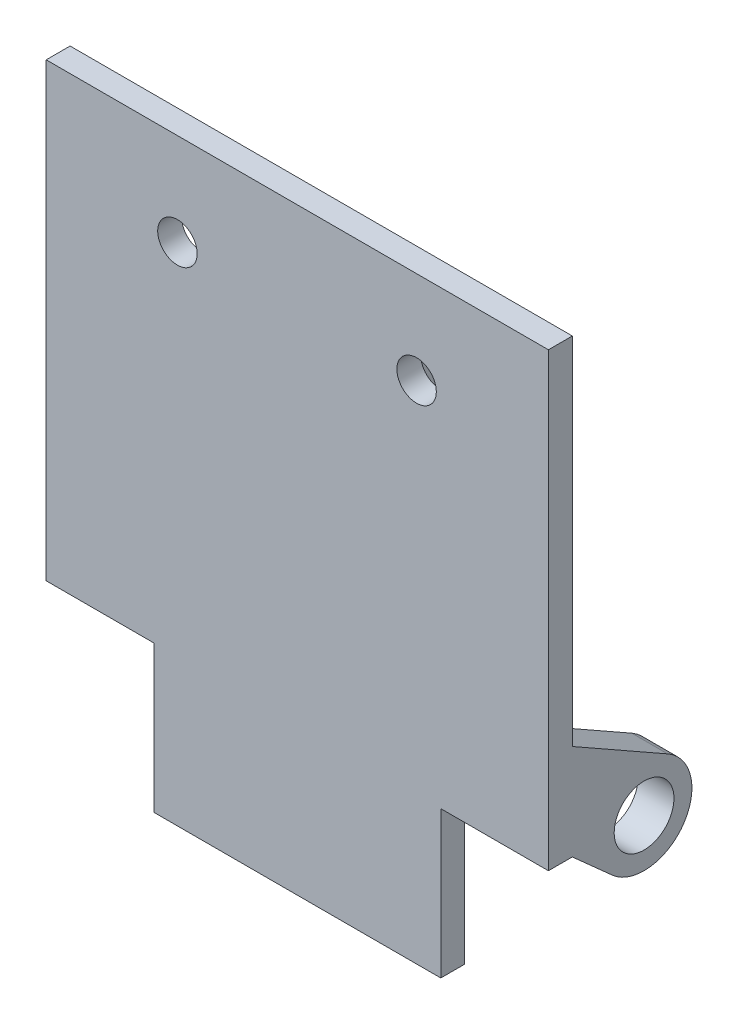
ISO-10303-21;
HEADER;
FILE_DESCRIPTION(('STEP AP214'),'2;1');
FILE_NAME('part.step','',(''),(''),'','','');
FILE_SCHEMA(('AUTOMOTIVE_DESIGN { 1 0 10303 214 1 1 1 1 }'));
ENDSEC;
DATA;
#1=APPLICATION_CONTEXT('core data for automotive mechanical design processes');
#2=APPLICATION_PROTOCOL_DEFINITION('international standard','automotive_design',2000,#1);
#3=PRODUCT_CONTEXT('',#1,'mechanical');
#4=PRODUCT('Part','Part','',(#3));
#5=PRODUCT_RELATED_PRODUCT_CATEGORY('part','',(#4));
#6=PRODUCT_DEFINITION_FORMATION('','',#4);
#7=PRODUCT_DEFINITION_CONTEXT('part definition',#1,'design');
#8=PRODUCT_DEFINITION('design','',#6,#7);
#9=PRODUCT_DEFINITION_SHAPE('','',#8);
#10=(LENGTH_UNIT() NAMED_UNIT(*) SI_UNIT(.MILLI.,.METRE.));
#11=(NAMED_UNIT(*) PLANE_ANGLE_UNIT() SI_UNIT($,.RADIAN.));
#12=(NAMED_UNIT(*) SI_UNIT($,.STERADIAN.) SOLID_ANGLE_UNIT());
#13=UNCERTAINTY_MEASURE_WITH_UNIT(LENGTH_MEASURE(1.E-05),#10,'distance_accuracy_value','');
#14=(GEOMETRIC_REPRESENTATION_CONTEXT(3) GLOBAL_UNCERTAINTY_ASSIGNED_CONTEXT((#13)) GLOBAL_UNIT_ASSIGNED_CONTEXT((#10,
#11,#12)) REPRESENTATION_CONTEXT('',''));
#15=CARTESIAN_POINT('',(0.,0.,0.));
#16=DIRECTION('',(0.,0.,1.));
#17=DIRECTION('',(1.,0.,0.));
#18=AXIS2_PLACEMENT_3D('',#15,#16,#17);
#19=CARTESIAN_POINT('',(0.,-22.,-9.));
#20=DIRECTION('',(1.,0.,0.));
#21=DIRECTION('',(0.,0.,-1.));
#22=AXIS2_PLACEMENT_3D('',#19,#20,#21);
#23=CYLINDRICAL_SURFACE('',#22,3.);
#24=DIRECTION('',(-1.,0.,0.));
#25=VECTOR('',#24,1.);
#26=CARTESIAN_POINT('',(0.,-22.,-12.));
#27=LINE('',#26,#25);
#28=CARTESIAN_POINT('',(-2.,-22.,-12.));
#29=VERTEX_POINT('',#28);
#30=CARTESIAN_POINT('',(-5.,-22.,-12.));
#31=VERTEX_POINT('',#30);
#32=EDGE_CURVE('E258',#29,#31,#27,.T.);
#33=ORIENTED_EDGE('',*,*,#32,.F.);
#34=CARTESIAN_POINT('',(-2.,-22.,-9.));
#35=DIRECTION('',(-1.,0.,0.));
#36=DIRECTION('',(0.,0.,1.));
#37=AXIS2_PLACEMENT_3D('',#34,#35,#36);
#38=CIRCLE('',#37,3.);
#39=CARTESIAN_POINT('',(-2.,-25.,-9.));
#40=VERTEX_POINT('',#39);
#41=EDGE_CURVE('E46',#40,#29,#38,.F.);
#42=ORIENTED_EDGE('',*,*,#41,.F.);
#43=DIRECTION('',(-1.,0.,0.));
#44=VECTOR('',#43,1.);
#45=CARTESIAN_POINT('',(0.,-25.,-9.));
#46=LINE('',#45,#44);
#47=CARTESIAN_POINT('',(-5.,-25.,-9.));
#48=VERTEX_POINT('',#47);
#49=EDGE_CURVE('E270',#48,#40,#46,.F.);
#50=ORIENTED_EDGE('',*,*,#49,.F.);
#51=CARTESIAN_POINT('',(-5.,-22.,-9.));
#52=DIRECTION('',(1.,0.,0.));
#53=DIRECTION('',(0.,0.,-1.));
#54=AXIS2_PLACEMENT_3D('',#51,#52,#53);
#55=CIRCLE('',#54,3.);
#56=EDGE_CURVE('E11',#31,#48,#55,.F.);
#57=ORIENTED_EDGE('',*,*,#56,.F.);
#58=EDGE_LOOP('',(#33,#42,#50,#57));
#59=FACE_BOUND('',#58,.T.);
#60=ADVANCED_FACE('F39',(#59),#23,.T.);
#61=CARTESIAN_POINT('',(3.,-25.,-5.));
#62=DIRECTION('',(0.,1.,0.));
#63=DIRECTION('',(0.,0.,1.));
#64=AXIS2_PLACEMENT_3D('',#61,#62,#63);
#65=CYLINDRICAL_SURFACE('',#64,5.);
#66=DIRECTION('',(0.,-1.,0.));
#67=VECTOR('',#66,1.);
#68=CARTESIAN_POINT('',(-2.,-25.,-5.));
#69=LINE('',#68,#67);
#70=CARTESIAN_POINT('',(-2.,-19.,-5.));
#71=VERTEX_POINT('',#70);
#72=CARTESIAN_POINT('',(-2.,-25.,-5.));
#73=VERTEX_POINT('',#72);
#74=EDGE_CURVE('E246',#71,#73,#69,.T.);
#75=ORIENTED_EDGE('',*,*,#74,.F.);
#76=CARTESIAN_POINT('',(3.,-19.,-5.));
#77=DIRECTION('',(0.,-1.,0.));
#78=DIRECTION('',(0.,0.,-1.));
#79=AXIS2_PLACEMENT_3D('',#76,#77,#78);
#80=CIRCLE('',#79,5.);
#81=CARTESIAN_POINT('',(3.,-19.,0.));
#82=VERTEX_POINT('',#81);
#83=EDGE_CURVE('E252',#71,#82,#80,.F.);
#84=ORIENTED_EDGE('',*,*,#83,.T.);
#85=DIRECTION('',(0.,-1.,0.));
#86=VECTOR('',#85,1.);
#87=CARTESIAN_POINT('',(3.,-25.,0.));
#88=LINE('',#87,#86);
#89=CARTESIAN_POINT('',(2.99999999999999,-25.,0.));
#90=VERTEX_POINT('',#89);
#91=EDGE_CURVE('E249',#90,#82,#88,.F.);
#92=ORIENTED_EDGE('',*,*,#91,.F.);
#93=CARTESIAN_POINT('',(3.,-25.,-5.));
#94=DIRECTION('',(0.,1.,0.));
#95=DIRECTION('',(0.,0.,1.));
#96=AXIS2_PLACEMENT_3D('',#93,#94,#95);
#97=CIRCLE('',#96,5.);
#98=EDGE_CURVE('E255',#90,#73,#97,.F.);
#99=ORIENTED_EDGE('',*,*,#98,.T.);
#100=EDGE_LOOP('',(#75,#84,#92,#99));
#101=FACE_BOUND('',#100,.T.);
#102=ADVANCED_FACE('F424',(#101),#65,.F.);
#103=CARTESIAN_POINT('',(3.,4.,-5.));
#104=DIRECTION('',(0.,1.,0.));
#105=DIRECTION('',(0.,0.,1.));
#106=AXIS2_PLACEMENT_3D('',#103,#104,#105);
#107=CYLINDRICAL_SURFACE('',#106,5.);
#108=DIRECTION('',(0.,-1.,0.));
#109=VECTOR('',#108,1.);
#110=CARTESIAN_POINT('',(-2.,4.,-5.));
#111=LINE('',#110,#109);
#112=CARTESIAN_POINT('',(-2.,10.,-5.));
#113=VERTEX_POINT('',#112);
#114=CARTESIAN_POINT('',(-2.,4.,-5.));
#115=VERTEX_POINT('',#114);
#116=EDGE_CURVE('E235',#113,#115,#111,.T.);
#117=ORIENTED_EDGE('',*,*,#116,.F.);
#118=CARTESIAN_POINT('',(3.,10.,-5.));
#119=DIRECTION('',(0.,-1.,0.));
#120=DIRECTION('',(1.,0.,0.));
#121=AXIS2_PLACEMENT_3D('',#118,#119,#120);
#122=CIRCLE('',#121,5.);
#123=CARTESIAN_POINT('',(3.,10.,0.));
#124=VERTEX_POINT('',#123);
#125=EDGE_CURVE('E241',#113,#124,#122,.F.);
#126=ORIENTED_EDGE('',*,*,#125,.T.);
#127=DIRECTION('',(0.,-1.,0.));
#128=VECTOR('',#127,1.);
#129=CARTESIAN_POINT('',(3.,4.,0.));
#130=LINE('',#129,#128);
#131=CARTESIAN_POINT('',(3.,4.,0.));
#132=VERTEX_POINT('',#131);
#133=EDGE_CURVE('E238',#132,#124,#130,.F.);
#134=ORIENTED_EDGE('',*,*,#133,.F.);
#135=CARTESIAN_POINT('',(3.,4.,-5.));
#136=DIRECTION('',(0.,1.,0.));
#137=DIRECTION('',(0.,0.,1.));
#138=AXIS2_PLACEMENT_3D('',#135,#136,#137);
#139=CIRCLE('',#138,5.);
#140=EDGE_CURVE('E244',#132,#115,#139,.F.);
#141=ORIENTED_EDGE('',*,*,#140,.T.);
#142=EDGE_LOOP('',(#117,#126,#134,#141));
#143=FACE_BOUND('',#142,.T.);
#144=ADVANCED_FACE('F469',(#143),#107,.F.);
#145=CARTESIAN_POINT('',(0.,0.,0.));
#146=DIRECTION('',(0.,0.,1.));
#147=DIRECTION('',(1.,0.,0.));
#148=AXIS2_PLACEMENT_3D('',#145,#146,#147);
#149=PLANE('',#148);
#150=CARTESIAN_POINT('',(-10.0242005084872,17.2660463593125,0.));
#151=DIRECTION('',(0.,0.,1.));
#152=DIRECTION('',(1.,0.,0.));
#153=AXIS2_PLACEMENT_3D('',#150,#151,#152);
#154=CIRCLE('',#153,1.65);
#155=CARTESIAN_POINT('',(-8.37420050848724,17.2660463593125,0.));
#156=VERTEX_POINT('',#155);
#157=EDGE_CURVE('E800',#156,#156,#154,.T.);
#158=ORIENTED_EDGE('',*,*,#157,.T.);
#159=EDGE_LOOP('',(#158));
#160=FACE_BOUND('',#159,.T.);
#161=CARTESIAN_POINT('',(9.97579949151276,17.2660463593125,0.));
#162=DIRECTION('',(0.,0.,1.));
#163=DIRECTION('',(1.,0.,0.));
#164=AXIS2_PLACEMENT_3D('',#161,#162,#163);
#165=CIRCLE('',#164,1.65);
#166=CARTESIAN_POINT('',(11.6257994915128,17.2660463593125,0.));
#167=VERTEX_POINT('',#166);
#168=EDGE_CURVE('E326',#167,#167,#165,.T.);
#169=ORIENTED_EDGE('',*,*,#168,.T.);
#170=EDGE_LOOP('',(#169));
#171=FACE_BOUND('',#170,.T.);
#172=DIRECTION('',(1.,0.,0.));
#173=VECTOR('',#172,1.);
#174=CARTESIAN_POINT('',(-21.,-25.,0.));
#175=LINE('',#174,#173);
#176=CARTESIAN_POINT('',(-12.,-25.,0.));
#177=VERTEX_POINT('',#176);
#178=CARTESIAN_POINT('',(-5.00000000000001,-25.,0.));
#179=VERTEX_POINT('',#178);
#180=EDGE_CURVE('E228',#177,#179,#175,.T.);
#181=ORIENTED_EDGE('',*,*,#180,.F.);
#182=DIRECTION('',(0.,-1.,0.));
#183=VECTOR('',#182,1.);
#184=CARTESIAN_POINT('',(-12.,-25.,0.));
#185=LINE('',#184,#183);
#186=CARTESIAN_POINT('',(-12.,-12.7339536406875,0.));
#187=VERTEX_POINT('',#186);
#188=EDGE_CURVE('E198',#187,#177,#185,.T.);
#189=ORIENTED_EDGE('',*,*,#188,.F.);
#190=DIRECTION('',(1.,0.,0.));
#191=VECTOR('',#190,1.);
#192=CARTESIAN_POINT('',(-21.,-12.7339536406875,0.));
#193=LINE('',#192,#191);
#194=CARTESIAN_POINT('',(-21.,-12.7339536406875,0.));
#195=VERTEX_POINT('',#194);
#196=EDGE_CURVE('E325',#195,#187,#193,.T.);
#197=ORIENTED_EDGE('',*,*,#196,.F.);
#198=DIRECTION('',(0.,-1.,0.));
#199=VECTOR('',#198,1.);
#200=CARTESIAN_POINT('',(-21.,25.,0.));
#201=LINE('',#200,#199);
#202=CARTESIAN_POINT('',(-21.,25.,0.));
#203=VERTEX_POINT('',#202);
#204=EDGE_CURVE('E207',#203,#195,#201,.T.);
#205=ORIENTED_EDGE('',*,*,#204,.F.);
#206=DIRECTION('',(-1.,0.,0.));
#207=VECTOR('',#206,1.);
#208=CARTESIAN_POINT('',(-21.,25.,0.));
#209=LINE('',#208,#207);
#210=CARTESIAN_POINT('',(21.,25.,0.));
#211=VERTEX_POINT('',#210);
#212=EDGE_CURVE('E223',#211,#203,#209,.T.);
#213=ORIENTED_EDGE('',*,*,#212,.F.);
#214=DIRECTION('',(0.,1.,0.));
#215=VECTOR('',#214,1.);
#216=CARTESIAN_POINT('',(21.,25.,0.));
#217=LINE('',#216,#215);
#218=CARTESIAN_POINT('',(21.,-4.73395364068748,0.));
#219=VERTEX_POINT('',#218);
#220=EDGE_CURVE('E221',#219,#211,#217,.T.);
#221=ORIENTED_EDGE('',*,*,#220,.F.);
#222=DIRECTION('',(1.,0.,0.));
#223=VECTOR('',#222,1.);
#224=CARTESIAN_POINT('',(18.,-4.73395364068748,0.));
#225=LINE('',#224,#223);
#226=CARTESIAN_POINT('',(18.,-4.73395364068748,0.));
#227=VERTEX_POINT('',#226);
#228=EDGE_CURVE('E371',#227,#219,#225,.T.);
#229=ORIENTED_EDGE('',*,*,#228,.F.);
#230=DIRECTION('',(0.,-1.,0.));
#231=VECTOR('',#230,1.);
#232=CARTESIAN_POINT('',(18.,-4.73395364068748,0.));
#233=LINE('',#232,#231);
#234=CARTESIAN_POINT('',(18.,-12.7339536406875,0.));
#235=VERTEX_POINT('',#234);
#236=EDGE_CURVE('E361',#227,#235,#233,.T.);
#237=ORIENTED_EDGE('',*,*,#236,.T.);
#238=DIRECTION('',(1.,0.,0.));
#239=VECTOR('',#238,1.);
#240=CARTESIAN_POINT('',(21.,-12.7339536406875,0.));
#241=LINE('',#240,#239);
#242=CARTESIAN_POINT('',(12.,-12.7339536406875,0.));
#243=VERTEX_POINT('',#242);
#244=EDGE_CURVE('E341',#243,#235,#241,.T.);
#245=ORIENTED_EDGE('',*,*,#244,.F.);
#246=DIRECTION('',(0.,1.,0.));
#247=VECTOR('',#246,1.);
#248=CARTESIAN_POINT('',(12.,-25.,0.));
#249=LINE('',#248,#247);
#250=CARTESIAN_POINT('',(12.,-25.,0.));
#251=VERTEX_POINT('',#250);
#252=EDGE_CURVE('E337',#251,#243,#249,.T.);
#253=ORIENTED_EDGE('',*,*,#252,.F.);
#254=EDGE_CURVE('E227',#90,#251,#175,.T.);
#255=ORIENTED_EDGE('',*,*,#254,.F.);
#256=ORIENTED_EDGE('',*,*,#91,.T.);
#257=DIRECTION('',(1.,0.,0.));
#258=VECTOR('',#257,1.);
#259=CARTESIAN_POINT('',(-5.,-19.,0.));
#260=LINE('',#259,#258);
#261=CARTESIAN_POINT('',(-5.,-19.,0.));
#262=VERTEX_POINT('',#261);
#263=EDGE_CURVE('E294',#262,#82,#260,.T.);
#264=ORIENTED_EDGE('',*,*,#263,.F.);
#265=DIRECTION('',(0.,1.,0.));
#266=VECTOR('',#265,1.);
#267=CARTESIAN_POINT('',(-5.,-25.,0.));
#268=LINE('',#267,#266);
#269=EDGE_CURVE('E291',#179,#262,#268,.T.);
#270=ORIENTED_EDGE('',*,*,#269,.F.);
#271=EDGE_LOOP('',(#181,#189,#197,#205,#213,#221,#229,#237,#245,#253,#255,#256,#264,#270));
#272=FACE_BOUND('',#271,.T.);
#273=ORIENTED_EDGE('',*,*,#133,.T.);
#274=DIRECTION('',(1.,0.,0.));
#275=VECTOR('',#274,1.);
#276=CARTESIAN_POINT('',(-5.,10.,0.));
#277=LINE('',#276,#275);
#278=CARTESIAN_POINT('',(-5.,10.,0.));
#279=VERTEX_POINT('',#278);
#280=EDGE_CURVE('E401',#279,#124,#277,.T.);
#281=ORIENTED_EDGE('',*,*,#280,.F.);
#282=DIRECTION('',(0.,1.,0.));
#283=VECTOR('',#282,1.);
#284=CARTESIAN_POINT('',(-5.,4.,0.));
#285=LINE('',#284,#283);
#286=CARTESIAN_POINT('',(-5.,4.,0.));
#287=VERTEX_POINT('',#286);
#288=EDGE_CURVE('E262',#287,#279,#285,.T.);
#289=ORIENTED_EDGE('',*,*,#288,.F.);
#290=DIRECTION('',(-1.,0.,0.));
#291=VECTOR('',#290,1.);
#292=CARTESIAN_POINT('',(-5.,4.,0.));
#293=LINE('',#292,#291);
#294=EDGE_CURVE('E392',#132,#287,#293,.T.);
#295=ORIENTED_EDGE('',*,*,#294,.F.);
#296=EDGE_LOOP('',(#273,#281,#289,#295));
#297=FACE_BOUND('',#296,.T.);
#298=ADVANCED_FACE('F322',(#160,#171,#272,#297),#149,.F.);
#299=CARTESIAN_POINT('',(21.,25.,2.));
#300=DIRECTION('',(-1.,0.,0.));
#301=DIRECTION('',(0.,-1.,0.));
#302=AXIS2_PLACEMENT_3D('',#299,#300,#301);
#303=PLANE('',#302);
#304=DIRECTION('',(0.,1.,0.));
#305=VECTOR('',#304,1.);
#306=CARTESIAN_POINT('',(21.,25.,2.));
#307=LINE('',#306,#305);
#308=CARTESIAN_POINT('',(21.,-12.7339536406875,2.));
#309=VERTEX_POINT('',#308);
#310=CARTESIAN_POINT('',(21.,25.,2.));
#311=VERTEX_POINT('',#310);
#312=EDGE_CURVE('E217',#309,#311,#307,.T.);
#313=ORIENTED_EDGE('',*,*,#312,.F.);
#314=DIRECTION('',(0.,0.,-1.));
#315=VECTOR('',#314,1.);
#316=CARTESIAN_POINT('',(21.,-12.7339536406875,2.));
#317=LINE('',#316,#315);
#318=CARTESIAN_POINT('',(21.,-12.7339536406875,0.));
#319=VERTEX_POINT('',#318);
#320=EDGE_CURVE('E347',#309,#319,#317,.T.);
#321=ORIENTED_EDGE('',*,*,#320,.T.);
#322=DIRECTION('',(0.,-0.666666666666667,-0.74535599249993));
#323=VECTOR('',#322,1.);
#324=CARTESIAN_POINT('',(21.,-12.7339536406875,0.));
#325=LINE('',#324,#323);
#326=CARTESIAN_POINT('',(21.,-15.7153776106872,-3.33333333333333));
#327=VERTEX_POINT('',#326);
#328=EDGE_CURVE('E373',#319,#327,#325,.T.);
#329=ORIENTED_EDGE('',*,*,#328,.T.);
#330=CARTESIAN_POINT('',(21.,-12.7339536406875,-6.));
#331=DIRECTION('',(1.,0.,0.));
#332=DIRECTION('',(0.,1.,0.));
#333=AXIS2_PLACEMENT_3D('',#330,#331,#332);
#334=CIRCLE('',#333,4.);
#335=CARTESIAN_POINT('',(21.,-9.25431730710868,-7.97284844477174));
#336=VERTEX_POINT('',#335);
#337=EDGE_CURVE('E362',#327,#336,#334,.T.);
#338=ORIENTED_EDGE('',*,*,#337,.T.);
#339=DIRECTION('',(0.,0.493212111192935,0.869909083394701));
#340=VECTOR('',#339,1.);
#341=CARTESIAN_POINT('',(21.,-4.73395364068748,0.));
#342=LINE('',#341,#340);
#343=EDGE_CURVE('E317',#336,#219,#342,.T.);
#344=ORIENTED_EDGE('',*,*,#343,.T.);
#345=ORIENTED_EDGE('',*,*,#220,.T.);
#346=DIRECTION('',(0.,0.,-1.));
#347=VECTOR('',#346,1.);
#348=CARTESIAN_POINT('',(21.,25.,2.));
#349=LINE('',#348,#347);
#350=EDGE_CURVE('E232',#311,#211,#349,.T.);
#351=ORIENTED_EDGE('',*,*,#350,.F.);
#352=EDGE_LOOP('',(#313,#321,#329,#338,#344,#345,#351));
#353=FACE_BOUND('',#352,.T.);
#354=CARTESIAN_POINT('',(21.,-12.7339536406875,-6.));
#355=DIRECTION('',(1.,0.,0.));
#356=DIRECTION('',(0.,1.,0.));
#357=AXIS2_PLACEMENT_3D('',#354,#355,#356);
#358=CIRCLE('',#357,2.5);
#359=CARTESIAN_POINT('',(21.,-10.2339536406875,-6.));
#360=VERTEX_POINT('',#359);
#361=EDGE_CURVE('E349',#360,#360,#358,.T.);
#362=ORIENTED_EDGE('',*,*,#361,.F.);
#363=EDGE_LOOP('',(#362));
#364=FACE_BOUND('',#363,.T.);
#365=ADVANCED_FACE('F311',(#353,#364),#303,.F.);
#366=CARTESIAN_POINT('',(-21.,25.,2.));
#367=DIRECTION('',(0.,-1.,0.));
#368=DIRECTION('',(0.,0.,-1.));
#369=AXIS2_PLACEMENT_3D('',#366,#367,#368);
#370=PLANE('',#369);
#371=ORIENTED_EDGE('',*,*,#212,.T.);
#372=DIRECTION('',(0.,0.,-1.));
#373=VECTOR('',#372,1.);
#374=CARTESIAN_POINT('',(-21.,25.,2.));
#375=LINE('',#374,#373);
#376=CARTESIAN_POINT('',(-21.,25.,2.));
#377=VERTEX_POINT('',#376);
#378=EDGE_CURVE('E215',#377,#203,#375,.T.);
#379=ORIENTED_EDGE('',*,*,#378,.F.);
#380=DIRECTION('',(-1.,0.,0.));
#381=VECTOR('',#380,1.);
#382=CARTESIAN_POINT('',(-21.,25.,2.));
#383=LINE('',#382,#381);
#384=EDGE_CURVE('E211',#311,#377,#383,.T.);
#385=ORIENTED_EDGE('',*,*,#384,.F.);
#386=ORIENTED_EDGE('',*,*,#350,.T.);
#387=EDGE_LOOP('',(#371,#379,#385,#386));
#388=FACE_BOUND('',#387,.T.);
#389=ADVANCED_FACE('F310',(#388),#370,.F.);
#390=CARTESIAN_POINT('',(-21.,25.,2.));
#391=DIRECTION('',(1.,0.,0.));
#392=DIRECTION('',(0.,1.,0.));
#393=AXIS2_PLACEMENT_3D('',#390,#391,#392);
#394=PLANE('',#393);
#395=ORIENTED_EDGE('',*,*,#204,.T.);
#396=DIRECTION('',(0.,0.,-1.));
#397=VECTOR('',#396,1.);
#398=CARTESIAN_POINT('',(-21.,-12.7339536406875,2.));
#399=LINE('',#398,#397);
#400=CARTESIAN_POINT('',(-21.,-12.7339536406875,2.));
#401=VERTEX_POINT('',#400);
#402=EDGE_CURVE('E191',#401,#195,#399,.T.);
#403=ORIENTED_EDGE('',*,*,#402,.F.);
#404=DIRECTION('',(0.,-1.,0.));
#405=VECTOR('',#404,1.);
#406=CARTESIAN_POINT('',(-21.,25.,2.));
#407=LINE('',#406,#405);
#408=EDGE_CURVE('E205',#377,#401,#407,.T.);
#409=ORIENTED_EDGE('',*,*,#408,.F.);
#410=ORIENTED_EDGE('',*,*,#378,.T.);
#411=EDGE_LOOP('',(#395,#403,#409,#410));
#412=FACE_BOUND('',#411,.T.);
#413=ADVANCED_FACE('F203',(#412),#394,.F.);
#414=CARTESIAN_POINT('',(-21.,-25.,2.));
#415=DIRECTION('',(0.,1.,0.));
#416=DIRECTION('',(0.,0.,1.));
#417=AXIS2_PLACEMENT_3D('',#414,#415,#416);
#418=PLANE('',#417);
#419=DIRECTION('',(0.,0.,1.));
#420=VECTOR('',#419,1.);
#421=CARTESIAN_POINT('',(-5.,-25.,-12.));
#422=LINE('',#421,#420);
#423=EDGE_CURVE('E284',#48,#179,#422,.T.);
#424=ORIENTED_EDGE('',*,*,#423,.F.);
#425=ORIENTED_EDGE('',*,*,#49,.T.);
#426=DIRECTION('',(0.,0.,1.));
#427=VECTOR('',#426,1.);
#428=CARTESIAN_POINT('',(-2.,-25.,-12.));
#429=LINE('',#428,#427);
#430=EDGE_CURVE('E278',#40,#73,#429,.T.);
#431=ORIENTED_EDGE('',*,*,#430,.T.);
#432=ORIENTED_EDGE('',*,*,#98,.F.);
#433=ORIENTED_EDGE('',*,*,#254,.T.);
#434=DIRECTION('',(0.,0.,-1.));
#435=VECTOR('',#434,1.);
#436=CARTESIAN_POINT('',(12.,-25.,2.));
#437=LINE('',#436,#435);
#438=CARTESIAN_POINT('',(12.,-25.,2.));
#439=VERTEX_POINT('',#438);
#440=EDGE_CURVE('E343',#439,#251,#437,.T.);
#441=ORIENTED_EDGE('',*,*,#440,.F.);
#442=DIRECTION('',(1.,0.,0.));
#443=VECTOR('',#442,1.);
#444=CARTESIAN_POINT('',(-21.,-25.,2.));
#445=LINE('',#444,#443);
#446=CARTESIAN_POINT('',(-12.,-25.,2.));
#447=VERTEX_POINT('',#446);
#448=EDGE_CURVE('E213',#447,#439,#445,.T.);
#449=ORIENTED_EDGE('',*,*,#448,.F.);
#450=DIRECTION('',(0.,0.,-1.));
#451=VECTOR('',#450,1.);
#452=CARTESIAN_POINT('',(-12.,-25.,2.));
#453=LINE('',#452,#451);
#454=EDGE_CURVE('E334',#447,#177,#453,.T.);
#455=ORIENTED_EDGE('',*,*,#454,.T.);
#456=ORIENTED_EDGE('',*,*,#180,.T.);
#457=EDGE_LOOP('',(#424,#425,#431,#432,#433,#441,#449,#455,#456));
#458=FACE_BOUND('',#457,.T.);
#459=ADVANCED_FACE('F427',(#458),#418,.F.);
#460=CARTESIAN_POINT('',(0.,0.,2.));
#461=DIRECTION('',(0.,0.,1.));
#462=DIRECTION('',(1.,0.,0.));
#463=AXIS2_PLACEMENT_3D('',#460,#461,#462);
#464=PLANE('',#463);
#465=CARTESIAN_POINT('',(-10.0242005084872,17.2660463593125,2.));
#466=DIRECTION('',(0.,0.,1.));
#467=DIRECTION('',(1.,0.,0.));
#468=AXIS2_PLACEMENT_3D('',#465,#466,#467);
#469=CIRCLE('',#468,1.65);
#470=CARTESIAN_POINT('',(-8.37420050848724,17.2660463593125,2.));
#471=VERTEX_POINT('',#470);
#472=EDGE_CURVE('E797',#471,#471,#469,.T.);
#473=ORIENTED_EDGE('',*,*,#472,.F.);
#474=EDGE_LOOP('',(#473));
#475=FACE_BOUND('',#474,.T.);
#476=CARTESIAN_POINT('',(9.97579949151276,17.2660463593125,2.));
#477=DIRECTION('',(0.,0.,1.));
#478=DIRECTION('',(1.,0.,0.));
#479=AXIS2_PLACEMENT_3D('',#476,#477,#478);
#480=CIRCLE('',#479,1.65);
#481=CARTESIAN_POINT('',(11.6257994915128,17.2660463593125,2.));
#482=VERTEX_POINT('',#481);
#483=EDGE_CURVE('E330',#482,#482,#480,.T.);
#484=ORIENTED_EDGE('',*,*,#483,.F.);
#485=EDGE_LOOP('',(#484));
#486=FACE_BOUND('',#485,.T.);
#487=DIRECTION('',(0.,-1.,0.));
#488=VECTOR('',#487,1.);
#489=CARTESIAN_POINT('',(-12.,-25.,2.));
#490=LINE('',#489,#488);
#491=CARTESIAN_POINT('',(-12.,-12.7339536406875,2.));
#492=VERTEX_POINT('',#491);
#493=EDGE_CURVE('E197',#492,#447,#490,.T.);
#494=ORIENTED_EDGE('',*,*,#493,.T.);
#495=ORIENTED_EDGE('',*,*,#448,.T.);
#496=DIRECTION('',(0.,1.,0.));
#497=VECTOR('',#496,1.);
#498=CARTESIAN_POINT('',(12.,-25.,2.));
#499=LINE('',#498,#497);
#500=CARTESIAN_POINT('',(12.,-12.7339536406875,2.));
#501=VERTEX_POINT('',#500);
#502=EDGE_CURVE('E339',#439,#501,#499,.T.);
#503=ORIENTED_EDGE('',*,*,#502,.T.);
#504=DIRECTION('',(1.,0.,0.));
#505=VECTOR('',#504,1.);
#506=CARTESIAN_POINT('',(21.,-12.7339536406875,2.));
#507=LINE('',#506,#505);
#508=EDGE_CURVE('E305',#501,#309,#507,.T.);
#509=ORIENTED_EDGE('',*,*,#508,.T.);
#510=ORIENTED_EDGE('',*,*,#312,.T.);
#511=ORIENTED_EDGE('',*,*,#384,.T.);
#512=ORIENTED_EDGE('',*,*,#408,.T.);
#513=DIRECTION('',(1.,0.,0.));
#514=VECTOR('',#513,1.);
#515=CARTESIAN_POINT('',(-21.,-12.7339536406875,2.));
#516=LINE('',#515,#514);
#517=EDGE_CURVE('E187',#401,#492,#516,.T.);
#518=ORIENTED_EDGE('',*,*,#517,.T.);
#519=EDGE_LOOP('',(#494,#495,#503,#509,#510,#511,#512,#518));
#520=FACE_BOUND('',#519,.T.);
#521=ADVANCED_FACE('F209',(#475,#486,#520),#464,.T.);
#522=CARTESIAN_POINT('',(-5.,-25.,-12.));
#523=DIRECTION('',(1.,0.,0.));
#524=DIRECTION('',(0.,0.,-1.));
#525=AXIS2_PLACEMENT_3D('',#522,#523,#524);
#526=PLANE('',#525);
#527=CARTESIAN_POINT('',(-5.,-20.6,-6.9));
#528=DIRECTION('',(-1.,0.,0.));
#529=DIRECTION('',(0.,0.,1.));
#530=AXIS2_PLACEMENT_3D('',#527,#528,#529);
#531=CIRCLE('',#530,1.);
#532=CARTESIAN_POINT('',(-5.,-20.6,-5.9));
#533=VERTEX_POINT('',#532);
#534=EDGE_CURVE('E263',#533,#533,#531,.T.);
#535=ORIENTED_EDGE('',*,*,#534,.F.);
#536=EDGE_LOOP('',(#535));
#537=FACE_BOUND('',#536,.T.);
#538=DIRECTION('',(0.,1.,0.));
#539=VECTOR('',#538,1.);
#540=CARTESIAN_POINT('',(-5.,-25.,-12.));
#541=LINE('',#540,#539);
#542=CARTESIAN_POINT('',(-5.,-19.,-12.));
#543=VERTEX_POINT('',#542);
#544=EDGE_CURVE('E287',#31,#543,#541,.T.);
#545=ORIENTED_EDGE('',*,*,#544,.F.);
#546=ORIENTED_EDGE('',*,*,#56,.T.);
#547=ORIENTED_EDGE('',*,*,#423,.T.);
#548=ORIENTED_EDGE('',*,*,#269,.T.);
#549=DIRECTION('',(0.,0.,1.));
#550=VECTOR('',#549,1.);
#551=CARTESIAN_POINT('',(-5.,-19.,-12.));
#552=LINE('',#551,#550);
#553=EDGE_CURVE('E224',#543,#262,#552,.T.);
#554=ORIENTED_EDGE('',*,*,#553,.F.);
#555=EDGE_LOOP('',(#545,#546,#547,#548,#554));
#556=FACE_BOUND('',#555,.T.);
#557=ADVANCED_FACE('F417',(#537,#556),#526,.F.);
#558=CARTESIAN_POINT('',(-5.,-19.,-12.));
#559=DIRECTION('',(0.,-1.,0.));
#560=DIRECTION('',(0.,0.,-1.));
#561=AXIS2_PLACEMENT_3D('',#558,#559,#560);
#562=PLANE('',#561);
#563=ORIENTED_EDGE('',*,*,#263,.T.);
#564=ORIENTED_EDGE('',*,*,#83,.F.);
#565=DIRECTION('',(0.,0.,1.));
#566=VECTOR('',#565,1.);
#567=CARTESIAN_POINT('',(-2.,-19.,-12.));
#568=LINE('',#567,#566);
#569=CARTESIAN_POINT('',(-2.,-19.,-12.));
#570=VERTEX_POINT('',#569);
#571=EDGE_CURVE('E298',#570,#71,#568,.T.);
#572=ORIENTED_EDGE('',*,*,#571,.F.);
#573=DIRECTION('',(1.,0.,0.));
#574=VECTOR('',#573,1.);
#575=CARTESIAN_POINT('',(-5.,-19.,-12.));
#576=LINE('',#575,#574);
#577=EDGE_CURVE('E282',#543,#570,#576,.T.);
#578=ORIENTED_EDGE('',*,*,#577,.F.);
#579=ORIENTED_EDGE('',*,*,#553,.T.);
#580=EDGE_LOOP('',(#563,#564,#572,#578,#579));
#581=FACE_BOUND('',#580,.T.);
#582=ADVANCED_FACE('F416',(#581),#562,.F.);
#583=CARTESIAN_POINT('',(-2.,-25.,-12.));
#584=DIRECTION('',(-1.,0.,0.));
#585=DIRECTION('',(0.,0.,1.));
#586=AXIS2_PLACEMENT_3D('',#583,#584,#585);
#587=PLANE('',#586);
#588=CARTESIAN_POINT('',(-2.00000000000001,-20.6,-6.9));
#589=DIRECTION('',(-1.,0.,0.));
#590=DIRECTION('',(0.,0.,1.));
#591=AXIS2_PLACEMENT_3D('',#588,#589,#590);
#592=CIRCLE('',#591,1.);
#593=CARTESIAN_POINT('',(-2.00000000000001,-20.6,-5.9));
#594=VERTEX_POINT('',#593);
#595=EDGE_CURVE('E259',#594,#594,#592,.T.);
#596=ORIENTED_EDGE('',*,*,#595,.T.);
#597=EDGE_LOOP('',(#596));
#598=FACE_BOUND('',#597,.T.);
#599=ORIENTED_EDGE('',*,*,#430,.F.);
#600=ORIENTED_EDGE('',*,*,#41,.T.);
#601=DIRECTION('',(0.,-1.,0.));
#602=VECTOR('',#601,1.);
#603=CARTESIAN_POINT('',(-2.,-25.,-12.));
#604=LINE('',#603,#602);
#605=EDGE_CURVE('E277',#570,#29,#604,.T.);
#606=ORIENTED_EDGE('',*,*,#605,.F.);
#607=ORIENTED_EDGE('',*,*,#571,.T.);
#608=ORIENTED_EDGE('',*,*,#74,.T.);
#609=EDGE_LOOP('',(#599,#600,#606,#607,#608));
#610=FACE_BOUND('',#609,.T.);
#611=ADVANCED_FACE('F274',(#598,#610),#587,.F.);
#612=CARTESIAN_POINT('',(0.,0.,-12.));
#613=DIRECTION('',(0.,0.,-1.));
#614=DIRECTION('',(-1.,0.,0.));
#615=AXIS2_PLACEMENT_3D('',#612,#613,#614);
#616=PLANE('',#615);
#617=ORIENTED_EDGE('',*,*,#605,.T.);
#618=ORIENTED_EDGE('',*,*,#32,.T.);
#619=ORIENTED_EDGE('',*,*,#544,.T.);
#620=ORIENTED_EDGE('',*,*,#577,.T.);
#621=EDGE_LOOP('',(#617,#618,#619,#620));
#622=FACE_BOUND('',#621,.T.);
#623=ADVANCED_FACE('F280',(#622),#616,.T.);
#624=CARTESIAN_POINT('',(-5.,4.,-12.));
#625=DIRECTION('',(1.,0.,0.));
#626=DIRECTION('',(0.,0.,-1.));
#627=AXIS2_PLACEMENT_3D('',#624,#625,#626);
#628=PLANE('',#627);
#629=CARTESIAN_POINT('',(-5.,6.3,-6.9));
#630=DIRECTION('',(-1.,0.,0.));
#631=DIRECTION('',(0.,0.,1.));
#632=AXIS2_PLACEMENT_3D('',#629,#630,#631);
#633=CIRCLE('',#632,1.);
#634=CARTESIAN_POINT('',(-5.,6.3,-5.9));
#635=VERTEX_POINT('',#634);
#636=EDGE_CURVE('E267',#635,#635,#633,.T.);
#637=ORIENTED_EDGE('',*,*,#636,.F.);
#638=EDGE_LOOP('',(#637));
#639=FACE_BOUND('',#638,.T.);
#640=ORIENTED_EDGE('',*,*,#288,.T.);
#641=DIRECTION('',(0.,0.,1.));
#642=VECTOR('',#641,1.);
#643=CARTESIAN_POINT('',(-5.,10.,-12.));
#644=LINE('',#643,#642);
#645=CARTESIAN_POINT('',(-5.,10.,-12.));
#646=VERTEX_POINT('',#645);
#647=EDGE_CURVE('E295',#646,#279,#644,.T.);
#648=ORIENTED_EDGE('',*,*,#647,.F.);
#649=DIRECTION('',(0.,1.,0.));
#650=VECTOR('',#649,1.);
#651=CARTESIAN_POINT('',(-5.,4.,-12.));
#652=LINE('',#651,#650);
#653=CARTESIAN_POINT('',(-5.,4.,-12.));
#654=VERTEX_POINT('',#653);
#655=EDGE_CURVE('E388',#654,#646,#652,.T.);
#656=ORIENTED_EDGE('',*,*,#655,.F.);
#657=DIRECTION('',(0.,0.,1.));
#658=VECTOR('',#657,1.);
#659=CARTESIAN_POINT('',(-5.,4.,-12.));
#660=LINE('',#659,#658);
#661=EDGE_CURVE('E398',#654,#287,#660,.T.);
#662=ORIENTED_EDGE('',*,*,#661,.T.);
#663=EDGE_LOOP('',(#640,#648,#656,#662));
#664=FACE_BOUND('',#663,.T.);
#665=ADVANCED_FACE('F500',(#639,#664),#628,.F.);
#666=CARTESIAN_POINT('',(-5.,10.,-12.));
#667=DIRECTION('',(0.,-1.,0.));
#668=DIRECTION('',(1.,0.,0.));
#669=AXIS2_PLACEMENT_3D('',#666,#667,#668);
#670=PLANE('',#669);
#671=ORIENTED_EDGE('',*,*,#280,.T.);
#672=ORIENTED_EDGE('',*,*,#125,.F.);
#673=DIRECTION('',(0.,0.,1.));
#674=VECTOR('',#673,1.);
#675=CARTESIAN_POINT('',(-2.,10.,-12.));
#676=LINE('',#675,#674);
#677=CARTESIAN_POINT('',(-2.,10.,-12.));
#678=VERTEX_POINT('',#677);
#679=EDGE_CURVE('E410',#678,#113,#676,.T.);
#680=ORIENTED_EDGE('',*,*,#679,.F.);
#681=DIRECTION('',(1.,0.,0.));
#682=VECTOR('',#681,1.);
#683=CARTESIAN_POINT('',(-5.,10.,-12.));
#684=LINE('',#683,#682);
#685=EDGE_CURVE('E391',#646,#678,#684,.T.);
#686=ORIENTED_EDGE('',*,*,#685,.F.);
#687=ORIENTED_EDGE('',*,*,#647,.T.);
#688=EDGE_LOOP('',(#671,#672,#680,#686,#687));
#689=FACE_BOUND('',#688,.T.);
#690=ADVANCED_FACE('F503',(#689),#670,.F.);
#691=CARTESIAN_POINT('',(-2.,4.,-12.));
#692=DIRECTION('',(-1.,0.,0.));
#693=DIRECTION('',(0.,0.,1.));
#694=AXIS2_PLACEMENT_3D('',#691,#692,#693);
#695=PLANE('',#694);
#696=CARTESIAN_POINT('',(-2.00000000000001,6.3,-6.9));
#697=DIRECTION('',(-1.,0.,0.));
#698=DIRECTION('',(0.,0.,1.));
#699=AXIS2_PLACEMENT_3D('',#696,#697,#698);
#700=CIRCLE('',#699,1.);
#701=CARTESIAN_POINT('',(-2.00000000000001,6.3,-5.9));
#702=VERTEX_POINT('',#701);
#703=EDGE_CURVE('E264',#702,#702,#700,.T.);
#704=ORIENTED_EDGE('',*,*,#703,.T.);
#705=EDGE_LOOP('',(#704));
#706=FACE_BOUND('',#705,.T.);
#707=ORIENTED_EDGE('',*,*,#679,.T.);
#708=ORIENTED_EDGE('',*,*,#116,.T.);
#709=DIRECTION('',(0.,0.,1.));
#710=VECTOR('',#709,1.);
#711=CARTESIAN_POINT('',(-2.,4.,-12.));
#712=LINE('',#711,#710);
#713=CARTESIAN_POINT('',(-2.,4.,-12.));
#714=VERTEX_POINT('',#713);
#715=EDGE_CURVE('E407',#714,#115,#712,.T.);
#716=ORIENTED_EDGE('',*,*,#715,.F.);
#717=DIRECTION('',(0.,-1.,0.));
#718=VECTOR('',#717,1.);
#719=CARTESIAN_POINT('',(-2.,4.,-12.));
#720=LINE('',#719,#718);
#721=EDGE_CURVE('E394',#678,#714,#720,.T.);
#722=ORIENTED_EDGE('',*,*,#721,.F.);
#723=EDGE_LOOP('',(#707,#708,#716,#722));
#724=FACE_BOUND('',#723,.T.);
#725=ADVANCED_FACE('F507',(#706,#724),#695,.F.);
#726=CARTESIAN_POINT('',(-5.,4.,-12.));
#727=DIRECTION('',(0.,1.,0.));
#728=DIRECTION('',(0.,0.,1.));
#729=AXIS2_PLACEMENT_3D('',#726,#727,#728);
#730=PLANE('',#729);
#731=ORIENTED_EDGE('',*,*,#294,.T.);
#732=ORIENTED_EDGE('',*,*,#661,.F.);
#733=DIRECTION('',(-1.,0.,0.));
#734=VECTOR('',#733,1.);
#735=CARTESIAN_POINT('',(-5.,4.,-12.));
#736=LINE('',#735,#734);
#737=EDGE_CURVE('E396',#714,#654,#736,.T.);
#738=ORIENTED_EDGE('',*,*,#737,.F.);
#739=ORIENTED_EDGE('',*,*,#715,.T.);
#740=ORIENTED_EDGE('',*,*,#140,.F.);
#741=EDGE_LOOP('',(#731,#732,#738,#739,#740));
#742=FACE_BOUND('',#741,.T.);
#743=ADVANCED_FACE('F511',(#742),#730,.F.);
#744=CARTESIAN_POINT('',(0.,0.,-12.));
#745=DIRECTION('',(0.,0.,-1.));
#746=DIRECTION('',(-1.,0.,0.));
#747=AXIS2_PLACEMENT_3D('',#744,#745,#746);
#748=PLANE('',#747);
#749=ORIENTED_EDGE('',*,*,#655,.T.);
#750=ORIENTED_EDGE('',*,*,#685,.T.);
#751=ORIENTED_EDGE('',*,*,#721,.T.);
#752=ORIENTED_EDGE('',*,*,#737,.T.);
#753=EDGE_LOOP('',(#749,#750,#751,#752));
#754=FACE_BOUND('',#753,.T.);
#755=ADVANCED_FACE('F515',(#754),#748,.T.);
#756=CARTESIAN_POINT('',(21.,-20.6,-6.9));
#757=DIRECTION('',(-1.,0.,0.));
#758=DIRECTION('',(0.,0.,1.));
#759=AXIS2_PLACEMENT_3D('',#756,#757,#758);
#760=CYLINDRICAL_SURFACE('',#759,1.);
#761=CARTESIAN_POINT('',(-5.,-20.6,-5.9));
#762=CARTESIAN_POINT('',(-4.96875,-20.6,-5.9));
#763=CARTESIAN_POINT('',(-4.9375,-20.6,-5.9));
#764=CARTESIAN_POINT('',(-4.875,-20.6,-5.9));
#765=CARTESIAN_POINT('',(-4.84375,-20.6,-5.9));
#766=CARTESIAN_POINT('',(-4.78125,-20.6,-5.9));
#767=CARTESIAN_POINT('',(-4.75,-20.6,-5.9));
#768=CARTESIAN_POINT('',(-4.6875,-20.6,-5.9));
#769=CARTESIAN_POINT('',(-4.65625,-20.6,-5.9));
#770=CARTESIAN_POINT('',(-4.59375,-20.6,-5.9));
#771=CARTESIAN_POINT('',(-4.5625,-20.6,-5.9));
#772=CARTESIAN_POINT('',(-4.5,-20.6,-5.9));
#773=CARTESIAN_POINT('',(-4.46875,-20.6,-5.9));
#774=CARTESIAN_POINT('',(-4.40625,-20.6,-5.9));
#775=CARTESIAN_POINT('',(-4.375,-20.6,-5.9));
#776=CARTESIAN_POINT('',(-4.3125,-20.6,-5.9));
#777=CARTESIAN_POINT('',(-4.28125,-20.6,-5.9));
#778=CARTESIAN_POINT('',(-4.21875,-20.6,-5.9));
#779=CARTESIAN_POINT('',(-4.1875,-20.6,-5.9));
#780=CARTESIAN_POINT('',(-4.125,-20.6,-5.9));
#781=CARTESIAN_POINT('',(-4.09375,-20.6,-5.9));
#782=CARTESIAN_POINT('',(-4.03125,-20.6,-5.9));
#783=CARTESIAN_POINT('',(-4.,-20.6,-5.9));
#784=CARTESIAN_POINT('',(-3.9375,-20.6,-5.9));
#785=CARTESIAN_POINT('',(-3.90625,-20.6,-5.9));
#786=CARTESIAN_POINT('',(-3.84375,-20.6,-5.9));
#787=CARTESIAN_POINT('',(-3.8125,-20.6,-5.9));
#788=CARTESIAN_POINT('',(-3.75,-20.6,-5.9));
#789=CARTESIAN_POINT('',(-3.71875,-20.6,-5.9));
#790=CARTESIAN_POINT('',(-3.65625,-20.6,-5.9));
#791=CARTESIAN_POINT('',(-3.625,-20.6,-5.9));
#792=CARTESIAN_POINT('',(-3.5625,-20.6,-5.9));
#793=CARTESIAN_POINT('',(-3.53125,-20.6,-5.9));
#794=CARTESIAN_POINT('',(-3.46875,-20.6,-5.9));
#795=CARTESIAN_POINT('',(-3.4375,-20.6,-5.9));
#796=CARTESIAN_POINT('',(-3.375,-20.6,-5.9));
#797=CARTESIAN_POINT('',(-3.34375,-20.6,-5.9));
#798=CARTESIAN_POINT('',(-3.28125,-20.6,-5.9));
#799=CARTESIAN_POINT('',(-3.25,-20.6,-5.9));
#800=CARTESIAN_POINT('',(-3.1875,-20.6,-5.9));
#801=CARTESIAN_POINT('',(-3.15625,-20.6,-5.9));
#802=CARTESIAN_POINT('',(-3.09375,-20.6,-5.9));
#803=CARTESIAN_POINT('',(-3.0625,-20.6,-5.9));
#804=CARTESIAN_POINT('',(-3.,-20.6,-5.9));
#805=CARTESIAN_POINT('',(-2.96875,-20.6,-5.9));
#806=CARTESIAN_POINT('',(-2.90625,-20.6,-5.9));
#807=CARTESIAN_POINT('',(-2.875,-20.6,-5.9));
#808=CARTESIAN_POINT('',(-2.8125,-20.6,-5.9));
#809=CARTESIAN_POINT('',(-2.78125,-20.6,-5.9));
#810=CARTESIAN_POINT('',(-2.71875,-20.6,-5.9));
#811=CARTESIAN_POINT('',(-2.6875,-20.6,-5.9));
#812=CARTESIAN_POINT('',(-2.625,-20.6,-5.9));
#813=CARTESIAN_POINT('',(-2.59375,-20.6,-5.9));
#814=CARTESIAN_POINT('',(-2.53125000000001,-20.6,-5.9));
#815=CARTESIAN_POINT('',(-2.50000000000001,-20.6,-5.9));
#816=CARTESIAN_POINT('',(-2.43750000000001,-20.6,-5.9));
#817=CARTESIAN_POINT('',(-2.40625000000001,-20.6,-5.9));
#818=CARTESIAN_POINT('',(-2.34375000000001,-20.6,-5.9));
#819=CARTESIAN_POINT('',(-2.31250000000001,-20.6,-5.9));
#820=CARTESIAN_POINT('',(-2.25000000000001,-20.6,-5.9));
#821=CARTESIAN_POINT('',(-2.21875000000001,-20.6,-5.9));
#822=CARTESIAN_POINT('',(-2.15625000000001,-20.6,-5.9));
#823=CARTESIAN_POINT('',(-2.12500000000001,-20.6,-5.9));
#824=CARTESIAN_POINT('',(-2.06250000000001,-20.6,-5.9));
#825=CARTESIAN_POINT('',(-2.03125000000001,-20.6,-5.9));
#826=CARTESIAN_POINT('',(-2.00000000000001,-20.6,-5.9));
#827=B_SPLINE_CURVE_WITH_KNOTS('',3,(#761,#762,#763,#764,#765,#766,#767,#768,#769,#770,#771,
#772,#773,#774,#775,#776,#777,#778,#779,#780,#781,#782,#783,#784,#785,#786,#787,#788,#789,#790,
#791,#792,#793,#794,#795,#796,#797,#798,#799,#800,#801,#802,#803,#804,#805,#806,#807,#808,#809,
#810,#811,#812,#813,#814,#815,#816,#817,#818,#819,#820,#821,#822,#823,#824,#825,#826),
.UNSPECIFIED.,.F.,.F.,(4,2,2,2,2,2,2,2,2,2,2,2,2,2,2,2,2,2,2,2,2,2,2,2,2,2,2,2,2,2,2,2,4),(0.,
0.0937500000000001,0.1875,0.28125,0.375,0.46875,0.5625,0.656250000000001,0.750000000000001,
0.843749999999997,0.937499999999997,1.03125,1.125,1.21875,1.3125,1.40625,1.5,1.59375,1.6875,
1.78125,1.875,1.96875,2.0625,2.15625,2.25,2.34375,2.4375,2.53125,2.625,2.71875,2.8125,2.90625,
3.),.UNSPECIFIED.);
#828=EDGE_CURVE('BSEAM519',#533,#594,#827,.T.);
#829=ORIENTED_EDGE('',*,*,#534,.T.);
#830=ORIENTED_EDGE('',*,*,#595,.F.);
#831=ORIENTED_EDGE('',*,*,#828,.T.);
#832=ORIENTED_EDGE('',*,*,#828,.F.);
#833=EDGE_LOOP('',(#829,#831,#830,#832));
#834=FACE_BOUND('',#833,.T.);
#835=ADVANCED_FACE('F519',(#834),#760,.F.);
#836=CARTESIAN_POINT('',(21.,6.3,-6.9));
#837=DIRECTION('',(-1.,0.,0.));
#838=DIRECTION('',(0.,0.,1.));
#839=AXIS2_PLACEMENT_3D('',#836,#837,#838);
#840=CYLINDRICAL_SURFACE('',#839,1.);
#841=CARTESIAN_POINT('',(-5.,6.3,-5.9));
#842=CARTESIAN_POINT('',(-4.96875,6.3,-5.9));
#843=CARTESIAN_POINT('',(-4.9375,6.3,-5.9));
#844=CARTESIAN_POINT('',(-4.875,6.3,-5.9));
#845=CARTESIAN_POINT('',(-4.84375,6.3,-5.9));
#846=CARTESIAN_POINT('',(-4.78125,6.3,-5.9));
#847=CARTESIAN_POINT('',(-4.75,6.3,-5.9));
#848=CARTESIAN_POINT('',(-4.6875,6.3,-5.9));
#849=CARTESIAN_POINT('',(-4.65625,6.3,-5.9));
#850=CARTESIAN_POINT('',(-4.59375,6.3,-5.9));
#851=CARTESIAN_POINT('',(-4.5625,6.3,-5.9));
#852=CARTESIAN_POINT('',(-4.5,6.3,-5.9));
#853=CARTESIAN_POINT('',(-4.46875,6.3,-5.9));
#854=CARTESIAN_POINT('',(-4.40625,6.3,-5.9));
#855=CARTESIAN_POINT('',(-4.375,6.3,-5.9));
#856=CARTESIAN_POINT('',(-4.3125,6.3,-5.9));
#857=CARTESIAN_POINT('',(-4.28125,6.3,-5.9));
#858=CARTESIAN_POINT('',(-4.21875,6.3,-5.9));
#859=CARTESIAN_POINT('',(-4.1875,6.3,-5.9));
#860=CARTESIAN_POINT('',(-4.125,6.3,-5.9));
#861=CARTESIAN_POINT('',(-4.09375,6.3,-5.9));
#862=CARTESIAN_POINT('',(-4.03125,6.3,-5.9));
#863=CARTESIAN_POINT('',(-4.,6.3,-5.9));
#864=CARTESIAN_POINT('',(-3.9375,6.3,-5.9));
#865=CARTESIAN_POINT('',(-3.90625,6.3,-5.9));
#866=CARTESIAN_POINT('',(-3.84375,6.3,-5.9));
#867=CARTESIAN_POINT('',(-3.8125,6.3,-5.9));
#868=CARTESIAN_POINT('',(-3.75,6.3,-5.9));
#869=CARTESIAN_POINT('',(-3.71875,6.3,-5.9));
#870=CARTESIAN_POINT('',(-3.65625,6.3,-5.9));
#871=CARTESIAN_POINT('',(-3.625,6.3,-5.9));
#872=CARTESIAN_POINT('',(-3.5625,6.3,-5.9));
#873=CARTESIAN_POINT('',(-3.53125,6.3,-5.9));
#874=CARTESIAN_POINT('',(-3.46875,6.3,-5.9));
#875=CARTESIAN_POINT('',(-3.4375,6.3,-5.9));
#876=CARTESIAN_POINT('',(-3.375,6.3,-5.9));
#877=CARTESIAN_POINT('',(-3.34375,6.3,-5.9));
#878=CARTESIAN_POINT('',(-3.28125,6.3,-5.9));
#879=CARTESIAN_POINT('',(-3.25,6.3,-5.9));
#880=CARTESIAN_POINT('',(-3.1875,6.3,-5.9));
#881=CARTESIAN_POINT('',(-3.15625,6.3,-5.9));
#882=CARTESIAN_POINT('',(-3.09375,6.3,-5.9));
#883=CARTESIAN_POINT('',(-3.0625,6.3,-5.9));
#884=CARTESIAN_POINT('',(-3.,6.3,-5.9));
#885=CARTESIAN_POINT('',(-2.96875,6.3,-5.9));
#886=CARTESIAN_POINT('',(-2.90625,6.3,-5.9));
#887=CARTESIAN_POINT('',(-2.875,6.3,-5.9));
#888=CARTESIAN_POINT('',(-2.8125,6.3,-5.9));
#889=CARTESIAN_POINT('',(-2.78125,6.3,-5.9));
#890=CARTESIAN_POINT('',(-2.71875,6.3,-5.9));
#891=CARTESIAN_POINT('',(-2.6875,6.3,-5.9));
#892=CARTESIAN_POINT('',(-2.625,6.3,-5.9));
#893=CARTESIAN_POINT('',(-2.59375,6.3,-5.9));
#894=CARTESIAN_POINT('',(-2.53125000000001,6.3,-5.9));
#895=CARTESIAN_POINT('',(-2.50000000000001,6.3,-5.9));
#896=CARTESIAN_POINT('',(-2.43750000000001,6.3,-5.9));
#897=CARTESIAN_POINT('',(-2.40625000000001,6.3,-5.9));
#898=CARTESIAN_POINT('',(-2.34375000000001,6.3,-5.9));
#899=CARTESIAN_POINT('',(-2.31250000000001,6.3,-5.9));
#900=CARTESIAN_POINT('',(-2.25000000000001,6.3,-5.9));
#901=CARTESIAN_POINT('',(-2.21875000000001,6.3,-5.9));
#902=CARTESIAN_POINT('',(-2.15625000000001,6.3,-5.9));
#903=CARTESIAN_POINT('',(-2.12500000000001,6.3,-5.9));
#904=CARTESIAN_POINT('',(-2.06250000000001,6.3,-5.9));
#905=CARTESIAN_POINT('',(-2.03125000000001,6.3,-5.9));
#906=CARTESIAN_POINT('',(-2.00000000000001,6.3,-5.9));
#907=B_SPLINE_CURVE_WITH_KNOTS('',3,(#841,#842,#843,#844,#845,#846,#847,#848,#849,#850,#851,
#852,#853,#854,#855,#856,#857,#858,#859,#860,#861,#862,#863,#864,#865,#866,#867,#868,#869,#870,
#871,#872,#873,#874,#875,#876,#877,#878,#879,#880,#881,#882,#883,#884,#885,#886,#887,#888,#889,
#890,#891,#892,#893,#894,#895,#896,#897,#898,#899,#900,#901,#902,#903,#904,#905,#906),
.UNSPECIFIED.,.F.,.F.,(4,2,2,2,2,2,2,2,2,2,2,2,2,2,2,2,2,2,2,2,2,2,2,2,2,2,2,2,2,2,2,2,4),(0.,
0.0937500000000001,0.1875,0.28125,0.375,0.46875,0.5625,0.656250000000001,0.750000000000001,
0.843749999999997,0.937499999999997,1.03125,1.125,1.21875,1.3125,1.40625,1.5,1.59375,1.6875,
1.78125,1.875,1.96875,2.0625,2.15625,2.25,2.34375,2.4375,2.53125,2.625,2.71875,2.8125,2.90625,
3.),.UNSPECIFIED.);
#908=EDGE_CURVE('BSEAM523',#635,#702,#907,.T.);
#909=ORIENTED_EDGE('',*,*,#636,.T.);
#910=ORIENTED_EDGE('',*,*,#703,.F.);
#911=ORIENTED_EDGE('',*,*,#908,.T.);
#912=ORIENTED_EDGE('',*,*,#908,.F.);
#913=EDGE_LOOP('',(#909,#911,#910,#912));
#914=FACE_BOUND('',#913,.T.);
#915=ADVANCED_FACE('F523',(#914),#840,.F.);
#916=CARTESIAN_POINT('',(18.,-4.73395364068748,0.));
#917=DIRECTION('',(0.,0.869909083394701,-0.493212111192935));
#918=DIRECTION('',(0.,0.493212111192935,0.869909083394701));
#919=AXIS2_PLACEMENT_3D('',#916,#917,#918);
#920=PLANE('',#919);
#921=ORIENTED_EDGE('',*,*,#343,.F.);
#922=DIRECTION('',(1.,0.,0.));
#923=VECTOR('',#922,1.);
#924=CARTESIAN_POINT('',(18.,-9.25431730710868,-7.97284844477174));
#925=LINE('',#924,#923);
#926=CARTESIAN_POINT('',(18.,-9.25431730710868,-7.97284844477174));
#927=VERTEX_POINT('',#926);
#928=EDGE_CURVE('E377',#927,#336,#925,.T.);
#929=ORIENTED_EDGE('',*,*,#928,.F.);
#930=DIRECTION('',(0.,0.493212111192935,0.869909083394701));
#931=VECTOR('',#930,1.);
#932=CARTESIAN_POINT('',(18.,-4.73395364068748,0.));
#933=LINE('',#932,#931);
#934=EDGE_CURVE('E358',#927,#227,#933,.T.);
#935=ORIENTED_EDGE('',*,*,#934,.T.);
#936=ORIENTED_EDGE('',*,*,#228,.T.);
#937=EDGE_LOOP('',(#921,#929,#935,#936));
#938=FACE_BOUND('',#937,.T.);
#939=ADVANCED_FACE('F450',(#938),#920,.T.);
#940=CARTESIAN_POINT('',(18.,-12.7339536406875,-6.));
#941=DIRECTION('',(1.,0.,0.));
#942=DIRECTION('',(0.,1.,0.));
#943=AXIS2_PLACEMENT_3D('',#940,#941,#942);
#944=CYLINDRICAL_SURFACE('',#943,4.);
#945=ORIENTED_EDGE('',*,*,#337,.F.);
#946=DIRECTION('',(1.,0.,0.));
#947=VECTOR('',#946,1.);
#948=CARTESIAN_POINT('',(18.,-15.7153776106872,-3.33333333333333));
#949=LINE('',#948,#947);
#950=CARTESIAN_POINT('',(18.,-15.7153776106872,-3.33333333333333));
#951=VERTEX_POINT('',#950);
#952=EDGE_CURVE('E379',#951,#327,#949,.T.);
#953=ORIENTED_EDGE('',*,*,#952,.F.);
#954=CARTESIAN_POINT('',(18.,-12.7339536406875,-6.));
#955=DIRECTION('',(1.,0.,0.));
#956=DIRECTION('',(0.,1.,0.));
#957=AXIS2_PLACEMENT_3D('',#954,#955,#956);
#958=CIRCLE('',#957,4.);
#959=EDGE_CURVE('E368',#951,#927,#958,.T.);
#960=ORIENTED_EDGE('',*,*,#959,.T.);
#961=ORIENTED_EDGE('',*,*,#928,.T.);
#962=EDGE_LOOP('',(#945,#953,#960,#961));
#963=FACE_BOUND('',#962,.T.);
#964=ADVANCED_FACE('F447',(#963),#944,.T.);
#965=CARTESIAN_POINT('',(18.,-12.7339536406875,0.));
#966=DIRECTION('',(0.,-0.74535599249993,0.666666666666667));
#967=DIRECTION('',(0.,-0.666666666666667,-0.74535599249993));
#968=AXIS2_PLACEMENT_3D('',#965,#966,#967);
#969=PLANE('',#968);
#970=ORIENTED_EDGE('',*,*,#328,.F.);
#971=DIRECTION('',(1.,0.,0.));
#972=VECTOR('',#971,1.);
#973=CARTESIAN_POINT('',(18.,-12.7339536406875,0.));
#974=LINE('',#973,#972);
#975=EDGE_CURVE('E381',#235,#319,#974,.T.);
#976=ORIENTED_EDGE('',*,*,#975,.F.);
#977=DIRECTION('',(0.,-0.666666666666667,-0.74535599249993));
#978=VECTOR('',#977,1.);
#979=CARTESIAN_POINT('',(18.,-12.7339536406875,0.));
#980=LINE('',#979,#978);
#981=EDGE_CURVE('E365',#235,#951,#980,.T.);
#982=ORIENTED_EDGE('',*,*,#981,.T.);
#983=ORIENTED_EDGE('',*,*,#952,.T.);
#984=EDGE_LOOP('',(#970,#976,#982,#983));
#985=FACE_BOUND('',#984,.T.);
#986=ADVANCED_FACE('F443',(#985),#969,.T.);
#987=CARTESIAN_POINT('',(18.,-12.7339536406875,-6.));
#988=DIRECTION('',(1.,0.,0.));
#989=DIRECTION('',(0.,1.,0.));
#990=AXIS2_PLACEMENT_3D('',#987,#988,#989);
#991=PLANE('',#990);
#992=CARTESIAN_POINT('',(18.,-12.7339536406875,-6.));
#993=DIRECTION('',(1.,0.,0.));
#994=DIRECTION('',(0.,1.,0.));
#995=AXIS2_PLACEMENT_3D('',#992,#993,#994);
#996=CIRCLE('',#995,2.5);
#997=CARTESIAN_POINT('',(18.,-10.2339536406875,-6.));
#998=VERTEX_POINT('',#997);
#999=EDGE_CURVE('E353',#998,#998,#996,.T.);
#1000=ORIENTED_EDGE('',*,*,#999,.T.);
#1001=EDGE_LOOP('',(#1000));
#1002=FACE_BOUND('',#1001,.T.);
#1003=ORIENTED_EDGE('',*,*,#934,.F.);
#1004=ORIENTED_EDGE('',*,*,#959,.F.);
#1005=ORIENTED_EDGE('',*,*,#981,.F.);
#1006=ORIENTED_EDGE('',*,*,#236,.F.);
#1007=EDGE_LOOP('',(#1003,#1004,#1005,#1006));
#1008=FACE_BOUND('',#1007,.T.);
#1009=ADVANCED_FACE('F452',(#1002,#1008),#991,.F.);
#1010=CARTESIAN_POINT('',(18.,-12.7339536406875,-6.));
#1011=DIRECTION('',(1.,0.,0.));
#1012=DIRECTION('',(0.,1.,0.));
#1013=AXIS2_PLACEMENT_3D('',#1010,#1011,#1012);
#1014=CYLINDRICAL_SURFACE('',#1013,2.5);
#1015=ORIENTED_EDGE('',*,*,#999,.F.);
#1016=EDGE_LOOP('',(#1015));
#1017=FACE_BOUND('',#1016,.T.);
#1018=ORIENTED_EDGE('',*,*,#361,.T.);
#1019=EDGE_LOOP('',(#1018));
#1020=FACE_BOUND('',#1019,.T.);
#1021=ADVANCED_FACE('F454',(#1017,#1020),#1014,.F.);
#1022=CARTESIAN_POINT('',(21.,-12.7339536406875,2.));
#1023=DIRECTION('',(0.,1.,0.));
#1024=DIRECTION('',(0.,0.,1.));
#1025=AXIS2_PLACEMENT_3D('',#1022,#1023,#1024);
#1026=PLANE('',#1025);
#1027=ORIENTED_EDGE('',*,*,#244,.T.);
#1028=ORIENTED_EDGE('',*,*,#975,.T.);
#1029=ORIENTED_EDGE('',*,*,#320,.F.);
#1030=ORIENTED_EDGE('',*,*,#508,.F.);
#1031=DIRECTION('',(0.,0.,-1.));
#1032=VECTOR('',#1031,1.);
#1033=CARTESIAN_POINT('',(12.,-12.7339536406875,2.));
#1034=LINE('',#1033,#1032);
#1035=EDGE_CURVE('E350',#501,#243,#1034,.T.);
#1036=ORIENTED_EDGE('',*,*,#1035,.T.);
#1037=EDGE_LOOP('',(#1027,#1028,#1029,#1030,#1036));
#1038=FACE_BOUND('',#1037,.T.);
#1039=ADVANCED_FACE('F438',(#1038),#1026,.F.);
#1040=CARTESIAN_POINT('',(12.,-25.,2.));
#1041=DIRECTION('',(-1.,0.,0.));
#1042=DIRECTION('',(0.,-1.,0.));
#1043=AXIS2_PLACEMENT_3D('',#1040,#1041,#1042);
#1044=PLANE('',#1043);
#1045=ORIENTED_EDGE('',*,*,#252,.T.);
#1046=ORIENTED_EDGE('',*,*,#1035,.F.);
#1047=ORIENTED_EDGE('',*,*,#502,.F.);
#1048=ORIENTED_EDGE('',*,*,#440,.T.);
#1049=EDGE_LOOP('',(#1045,#1046,#1047,#1048));
#1050=FACE_BOUND('',#1049,.T.);
#1051=ADVANCED_FACE('F434',(#1050),#1044,.F.);
#1052=CARTESIAN_POINT('',(-12.,-25.,2.));
#1053=DIRECTION('',(1.,0.,0.));
#1054=DIRECTION('',(0.,0.,-1.));
#1055=AXIS2_PLACEMENT_3D('',#1052,#1053,#1054);
#1056=PLANE('',#1055);
#1057=ORIENTED_EDGE('',*,*,#188,.T.);
#1058=ORIENTED_EDGE('',*,*,#454,.F.);
#1059=ORIENTED_EDGE('',*,*,#493,.F.);
#1060=DIRECTION('',(0.,0.,-1.));
#1061=VECTOR('',#1060,1.);
#1062=CARTESIAN_POINT('',(-12.,-12.7339536406875,2.));
#1063=LINE('',#1062,#1061);
#1064=EDGE_CURVE('E193',#492,#187,#1063,.T.);
#1065=ORIENTED_EDGE('',*,*,#1064,.T.);
#1066=EDGE_LOOP('',(#1057,#1058,#1059,#1065));
#1067=FACE_BOUND('',#1066,.T.);
#1068=ADVANCED_FACE('F431',(#1067),#1056,.F.);
#1069=CARTESIAN_POINT('',(-21.,-12.7339536406875,2.));
#1070=DIRECTION('',(0.,1.,0.));
#1071=DIRECTION('',(-1.,0.,0.));
#1072=AXIS2_PLACEMENT_3D('',#1069,#1070,#1071);
#1073=PLANE('',#1072);
#1074=ORIENTED_EDGE('',*,*,#196,.T.);
#1075=ORIENTED_EDGE('',*,*,#1064,.F.);
#1076=ORIENTED_EDGE('',*,*,#517,.F.);
#1077=ORIENTED_EDGE('',*,*,#402,.T.);
#1078=EDGE_LOOP('',(#1074,#1075,#1076,#1077));
#1079=FACE_BOUND('',#1078,.T.);
#1080=ADVANCED_FACE('F190',(#1079),#1073,.F.);
#1081=CARTESIAN_POINT('',(9.97579949151276,17.2660463593125,-12.));
#1082=DIRECTION('',(0.,0.,1.));
#1083=DIRECTION('',(1.,0.,0.));
#1084=AXIS2_PLACEMENT_3D('',#1081,#1082,#1083);
#1085=CYLINDRICAL_SURFACE('',#1084,1.65);
#1086=ORIENTED_EDGE('',*,*,#483,.T.);
#1087=EDGE_LOOP('',(#1086));
#1088=FACE_BOUND('',#1087,.T.);
#1089=ORIENTED_EDGE('',*,*,#168,.F.);
#1090=EDGE_LOOP('',(#1089));
#1091=FACE_BOUND('',#1090,.T.);
#1092=ADVANCED_FACE('F586',(#1088,#1091),#1085,.F.);
#1093=CARTESIAN_POINT('',(-10.0242005084872,17.2660463593125,-12.));
#1094=DIRECTION('',(0.,0.,1.));
#1095=DIRECTION('',(1.,0.,0.));
#1096=AXIS2_PLACEMENT_3D('',#1093,#1094,#1095);
#1097=CYLINDRICAL_SURFACE('',#1096,1.65);
#1098=ORIENTED_EDGE('',*,*,#472,.T.);
#1099=EDGE_LOOP('',(#1098));
#1100=FACE_BOUND('',#1099,.T.);
#1101=ORIENTED_EDGE('',*,*,#157,.F.);
#1102=EDGE_LOOP('',(#1101));
#1103=FACE_BOUND('',#1102,.T.);
#1104=ADVANCED_FACE('F612',(#1100,#1103),#1097,.F.);
#1105=CLOSED_SHELL('',(#60,#102,#144,#298,#365,#389,#413,#459,#521,#557,#582,#611,#623,#665,
#690,#725,#743,#755,#835,#915,#939,#964,#986,#1009,#1021,#1039,#1051,#1068,#1080,#1092,#1104));
#1106=MANIFOLD_SOLID_BREP('B2',#1105);
#1107=ADVANCED_BREP_SHAPE_REPRESENTATION('',(#18,#1106),#14);
#1108=SHAPE_DEFINITION_REPRESENTATION(#9,#1107);
ENDSEC;
END-ISO-10303-21;
